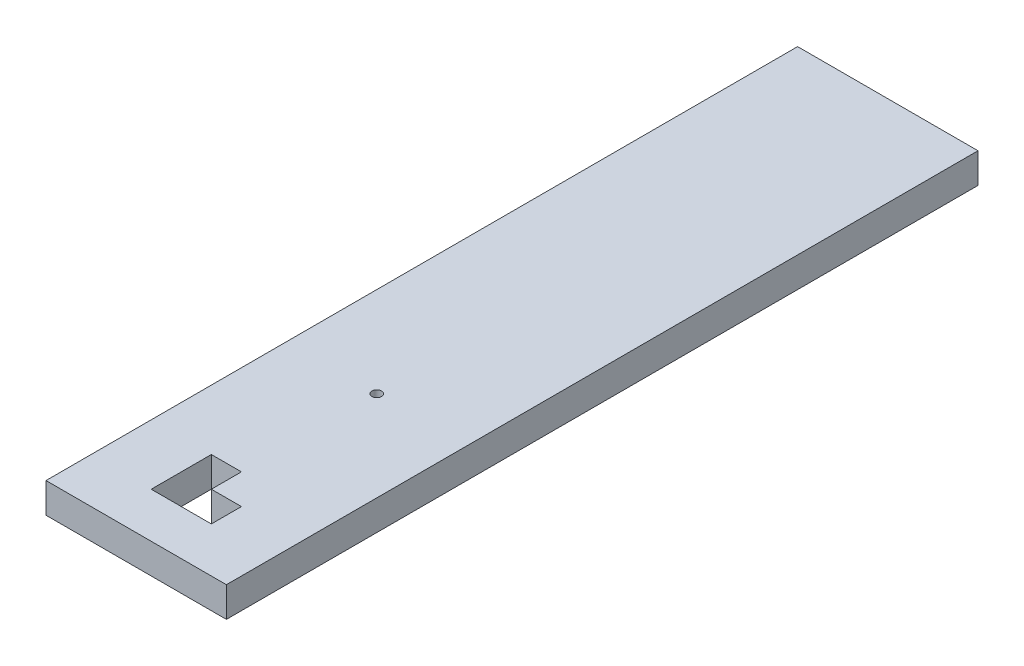
ISO-10303-21;
HEADER;
FILE_DESCRIPTION(('STEP AP214'),'2;1');
FILE_NAME('part.step','',(''),(''),'','','');
FILE_SCHEMA(('AUTOMOTIVE_DESIGN { 1 0 10303 214 1 1 1 1 }'));
ENDSEC;
DATA;
#1=APPLICATION_CONTEXT('core data for automotive mechanical design processes');
#2=APPLICATION_PROTOCOL_DEFINITION('international standard','automotive_design',2000,#1);
#3=PRODUCT_CONTEXT('',#1,'mechanical');
#4=PRODUCT('Part','Part','',(#3));
#5=PRODUCT_RELATED_PRODUCT_CATEGORY('part','',(#4));
#6=PRODUCT_DEFINITION_FORMATION('','',#4);
#7=PRODUCT_DEFINITION_CONTEXT('part definition',#1,'design');
#8=PRODUCT_DEFINITION('design','',#6,#7);
#9=PRODUCT_DEFINITION_SHAPE('','',#8);
#10=(LENGTH_UNIT() NAMED_UNIT(*) SI_UNIT(.MILLI.,.METRE.));
#11=(NAMED_UNIT(*) PLANE_ANGLE_UNIT() SI_UNIT($,.RADIAN.));
#12=(NAMED_UNIT(*) SI_UNIT($,.STERADIAN.) SOLID_ANGLE_UNIT());
#13=UNCERTAINTY_MEASURE_WITH_UNIT(LENGTH_MEASURE(1.E-05),#10,'distance_accuracy_value','');
#14=(GEOMETRIC_REPRESENTATION_CONTEXT(3) GLOBAL_UNCERTAINTY_ASSIGNED_CONTEXT((#13)) GLOBAL_UNIT_ASSIGNED_CONTEXT((#10,
#11,#12)) REPRESENTATION_CONTEXT('',''));
#15=CARTESIAN_POINT('',(0.,0.,0.));
#16=DIRECTION('',(0.,0.,1.));
#17=DIRECTION('',(1.,0.,0.));
#18=AXIS2_PLACEMENT_3D('',#15,#16,#17);
#19=CARTESIAN_POINT('',(0.,10.,0.));
#20=DIRECTION('',(0.,1.,0.));
#21=DIRECTION('',(0.,0.,1.));
#22=AXIS2_PLACEMENT_3D('',#19,#20,#21);
#23=PLANE('',#22);
#24=DIRECTION('',(0.,0.,1.));
#25=VECTOR('',#24,1.);
#26=CARTESIAN_POINT('',(0.,10.,0.));
#27=LINE('',#26,#25);
#28=CARTESIAN_POINT('',(0.,10.,0.));
#29=VERTEX_POINT('',#28);
#30=CARTESIAN_POINT('',(0.,10.,250.));
#31=VERTEX_POINT('',#30);
#32=EDGE_CURVE('E194',#29,#31,#27,.T.);
#33=ORIENTED_EDGE('',*,*,#32,.T.);
#34=DIRECTION('',(1.,0.,0.));
#35=VECTOR('',#34,1.);
#36=CARTESIAN_POINT('',(0.,10.,250.));
#37=LINE('',#36,#35);
#38=CARTESIAN_POINT('',(60.,10.,250.));
#39=VERTEX_POINT('',#38);
#40=EDGE_CURVE('E198',#31,#39,#37,.T.);
#41=ORIENTED_EDGE('',*,*,#40,.T.);
#42=DIRECTION('',(0.,0.,-1.));
#43=VECTOR('',#42,1.);
#44=CARTESIAN_POINT('',(60.,10.,0.));
#45=LINE('',#44,#43);
#46=CARTESIAN_POINT('',(60.,10.,0.));
#47=VERTEX_POINT('',#46);
#48=EDGE_CURVE('E202',#39,#47,#45,.T.);
#49=ORIENTED_EDGE('',*,*,#48,.T.);
#50=DIRECTION('',(-1.,0.,0.));
#51=VECTOR('',#50,1.);
#52=CARTESIAN_POINT('',(0.,10.,0.));
#53=LINE('',#52,#51);
#54=EDGE_CURVE('E205',#47,#29,#53,.T.);
#55=ORIENTED_EDGE('',*,*,#54,.T.);
#56=EDGE_LOOP('',(#33,#41,#49,#55));
#57=FACE_BOUND('',#56,.T.);
#58=CARTESIAN_POINT('',(30.,10.,170.));
#59=DIRECTION('',(0.,1.,0.));
#60=DIRECTION('',(0.,0.,1.));
#61=AXIS2_PLACEMENT_3D('',#58,#59,#60);
#62=CIRCLE('',#61,1.59999999999999);
#63=CARTESIAN_POINT('',(30.,10.,171.6));
#64=VERTEX_POINT('',#63);
#65=EDGE_CURVE('E186',#64,#64,#62,.T.);
#66=ORIENTED_EDGE('',*,*,#65,.F.);
#67=EDGE_LOOP('',(#66));
#68=FACE_BOUND('',#67,.T.);
#69=DIRECTION('',(0.,0.,1.));
#70=VECTOR('',#69,1.);
#71=CARTESIAN_POINT('',(20.,10.,215.));
#72=LINE('',#71,#70);
#73=CARTESIAN_POINT('',(20.,10.,215.));
#74=VERTEX_POINT('',#73);
#75=CARTESIAN_POINT('',(20.,10.,235.));
#76=VERTEX_POINT('',#75);
#77=EDGE_CURVE('E126',#74,#76,#72,.T.);
#78=ORIENTED_EDGE('',*,*,#77,.F.);
#79=DIRECTION('',(-1.,0.,0.));
#80=VECTOR('',#79,1.);
#81=CARTESIAN_POINT('',(20.,10.,215.));
#82=LINE('',#81,#80);
#83=CARTESIAN_POINT('',(30.,10.,215.));
#84=VERTEX_POINT('',#83);
#85=EDGE_CURVE('E117',#84,#74,#82,.T.);
#86=ORIENTED_EDGE('',*,*,#85,.F.);
#87=DIRECTION('',(0.,0.,-1.));
#88=VECTOR('',#87,1.);
#89=CARTESIAN_POINT('',(30.,10.,215.));
#90=LINE('',#89,#88);
#91=CARTESIAN_POINT('',(30.,10.,225.));
#92=VERTEX_POINT('',#91);
#93=EDGE_CURVE('E152',#92,#84,#90,.T.);
#94=ORIENTED_EDGE('',*,*,#93,.F.);
#95=DIRECTION('',(-1.,0.,0.));
#96=VECTOR('',#95,1.);
#97=CARTESIAN_POINT('',(30.,10.,225.));
#98=LINE('',#97,#96);
#99=CARTESIAN_POINT('',(40.,10.,225.));
#100=VERTEX_POINT('',#99);
#101=EDGE_CURVE('E149',#100,#92,#98,.T.);
#102=ORIENTED_EDGE('',*,*,#101,.F.);
#103=DIRECTION('',(0.,0.,-1.));
#104=VECTOR('',#103,1.);
#105=CARTESIAN_POINT('',(40.,10.,225.));
#106=LINE('',#105,#104);
#107=CARTESIAN_POINT('',(40.,10.,235.));
#108=VERTEX_POINT('',#107);
#109=EDGE_CURVE('E144',#108,#100,#106,.T.);
#110=ORIENTED_EDGE('',*,*,#109,.F.);
#111=DIRECTION('',(1.,0.,0.));
#112=VECTOR('',#111,1.);
#113=CARTESIAN_POINT('',(20.,10.,235.));
#114=LINE('',#113,#112);
#115=EDGE_CURVE('E140',#76,#108,#114,.T.);
#116=ORIENTED_EDGE('',*,*,#115,.F.);
#117=EDGE_LOOP('',(#78,#86,#94,#102,#110,#116));
#118=FACE_BOUND('',#117,.T.);
#119=ADVANCED_FACE('F39',(#57,#68,#118),#23,.T.);
#120=CARTESIAN_POINT('',(0.,0.,0.));
#121=DIRECTION('',(0.,1.,0.));
#122=DIRECTION('',(0.,0.,1.));
#123=AXIS2_PLACEMENT_3D('',#120,#121,#122);
#124=PLANE('',#123);
#125=CARTESIAN_POINT('',(30.,0.,170.));
#126=DIRECTION('',(0.,1.,0.));
#127=DIRECTION('',(0.,0.,1.));
#128=AXIS2_PLACEMENT_3D('',#125,#126,#127);
#129=CIRCLE('',#128,1.59999999999999);
#130=CARTESIAN_POINT('',(30.,0.,171.6));
#131=VERTEX_POINT('',#130);
#132=EDGE_CURVE('E135',#131,#131,#129,.T.);
#133=ORIENTED_EDGE('',*,*,#132,.T.);
#134=EDGE_LOOP('',(#133));
#135=FACE_BOUND('',#134,.T.);
#136=DIRECTION('',(0.,0.,1.));
#137=VECTOR('',#136,1.);
#138=CARTESIAN_POINT('',(0.,0.,0.));
#139=LINE('',#138,#137);
#140=CARTESIAN_POINT('',(0.,0.,0.));
#141=VERTEX_POINT('',#140);
#142=CARTESIAN_POINT('',(0.,0.,250.));
#143=VERTEX_POINT('',#142);
#144=EDGE_CURVE('E190',#141,#143,#139,.T.);
#145=ORIENTED_EDGE('',*,*,#144,.F.);
#146=DIRECTION('',(-1.,0.,0.));
#147=VECTOR('',#146,1.);
#148=CARTESIAN_POINT('',(0.,0.,0.));
#149=LINE('',#148,#147);
#150=CARTESIAN_POINT('',(60.,0.,0.));
#151=VERTEX_POINT('',#150);
#152=EDGE_CURVE('E199',#151,#141,#149,.T.);
#153=ORIENTED_EDGE('',*,*,#152,.F.);
#154=DIRECTION('',(0.,0.,-1.));
#155=VECTOR('',#154,1.);
#156=CARTESIAN_POINT('',(60.,0.,0.));
#157=LINE('',#156,#155);
#158=CARTESIAN_POINT('',(60.,0.,250.));
#159=VERTEX_POINT('',#158);
#160=EDGE_CURVE('E215',#159,#151,#157,.T.);
#161=ORIENTED_EDGE('',*,*,#160,.F.);
#162=DIRECTION('',(1.,0.,0.));
#163=VECTOR('',#162,1.);
#164=CARTESIAN_POINT('',(0.,0.,250.));
#165=LINE('',#164,#163);
#166=EDGE_CURVE('E212',#143,#159,#165,.T.);
#167=ORIENTED_EDGE('',*,*,#166,.F.);
#168=EDGE_LOOP('',(#145,#153,#161,#167));
#169=FACE_BOUND('',#168,.T.);
#170=DIRECTION('',(-1.,0.,0.));
#171=VECTOR('',#170,1.);
#172=CARTESIAN_POINT('',(20.,0.,215.));
#173=LINE('',#172,#171);
#174=CARTESIAN_POINT('',(30.,0.,215.));
#175=VERTEX_POINT('',#174);
#176=CARTESIAN_POINT('',(20.,0.,215.));
#177=VERTEX_POINT('',#176);
#178=EDGE_CURVE('E63',#175,#177,#173,.T.);
#179=ORIENTED_EDGE('',*,*,#178,.T.);
#180=DIRECTION('',(0.,0.,1.));
#181=VECTOR('',#180,1.);
#182=CARTESIAN_POINT('',(20.,0.,215.));
#183=LINE('',#182,#181);
#184=CARTESIAN_POINT('',(20.,0.,235.));
#185=VERTEX_POINT('',#184);
#186=EDGE_CURVE('E133',#177,#185,#183,.T.);
#187=ORIENTED_EDGE('',*,*,#186,.T.);
#188=DIRECTION('',(1.,0.,0.));
#189=VECTOR('',#188,1.);
#190=CARTESIAN_POINT('',(20.,0.,235.));
#191=LINE('',#190,#189);
#192=CARTESIAN_POINT('',(40.,0.,235.));
#193=VERTEX_POINT('',#192);
#194=EDGE_CURVE('E159',#185,#193,#191,.T.);
#195=ORIENTED_EDGE('',*,*,#194,.T.);
#196=DIRECTION('',(0.,0.,-1.));
#197=VECTOR('',#196,1.);
#198=CARTESIAN_POINT('',(40.,0.,225.));
#199=LINE('',#198,#197);
#200=CARTESIAN_POINT('',(40.,0.,225.));
#201=VERTEX_POINT('',#200);
#202=EDGE_CURVE('E163',#193,#201,#199,.T.);
#203=ORIENTED_EDGE('',*,*,#202,.T.);
#204=DIRECTION('',(-1.,0.,0.));
#205=VECTOR('',#204,1.);
#206=CARTESIAN_POINT('',(30.,0.,225.));
#207=LINE('',#206,#205);
#208=CARTESIAN_POINT('',(30.,0.,225.));
#209=VERTEX_POINT('',#208);
#210=EDGE_CURVE('E167',#201,#209,#207,.T.);
#211=ORIENTED_EDGE('',*,*,#210,.T.);
#212=DIRECTION('',(0.,0.,-1.));
#213=VECTOR('',#212,1.);
#214=CARTESIAN_POINT('',(30.,0.,215.));
#215=LINE('',#214,#213);
#216=EDGE_CURVE('E127',#209,#175,#215,.T.);
#217=ORIENTED_EDGE('',*,*,#216,.T.);
#218=EDGE_LOOP('',(#179,#187,#195,#203,#211,#217));
#219=FACE_BOUND('',#218,.T.);
#220=ADVANCED_FACE('F238',(#135,#169,#219),#124,.F.);
#221=CARTESIAN_POINT('',(0.,10.,0.));
#222=DIRECTION('',(1.,0.,0.));
#223=DIRECTION('',(0.,0.,-1.));
#224=AXIS2_PLACEMENT_3D('',#221,#222,#223);
#225=PLANE('',#224);
#226=ORIENTED_EDGE('',*,*,#144,.T.);
#227=DIRECTION('',(0.,-1.,0.));
#228=VECTOR('',#227,1.);
#229=CARTESIAN_POINT('',(0.,10.,250.));
#230=LINE('',#229,#228);
#231=EDGE_CURVE('E11',#31,#143,#230,.T.);
#232=ORIENTED_EDGE('',*,*,#231,.F.);
#233=ORIENTED_EDGE('',*,*,#32,.F.);
#234=DIRECTION('',(0.,-1.,0.));
#235=VECTOR('',#234,1.);
#236=CARTESIAN_POINT('',(0.,10.,0.));
#237=LINE('',#236,#235);
#238=EDGE_CURVE('E208',#29,#141,#237,.T.);
#239=ORIENTED_EDGE('',*,*,#238,.T.);
#240=EDGE_LOOP('',(#226,#232,#233,#239));
#241=FACE_BOUND('',#240,.T.);
#242=ADVANCED_FACE('F41',(#241),#225,.F.);
#243=CARTESIAN_POINT('',(0.,10.,250.));
#244=DIRECTION('',(0.,0.,-1.));
#245=DIRECTION('',(-1.,0.,0.));
#246=AXIS2_PLACEMENT_3D('',#243,#244,#245);
#247=PLANE('',#246);
#248=ORIENTED_EDGE('',*,*,#166,.T.);
#249=DIRECTION('',(0.,-1.,0.));
#250=VECTOR('',#249,1.);
#251=CARTESIAN_POINT('',(60.,10.,250.));
#252=LINE('',#251,#250);
#253=EDGE_CURVE('E48',#39,#159,#252,.T.);
#254=ORIENTED_EDGE('',*,*,#253,.F.);
#255=ORIENTED_EDGE('',*,*,#40,.F.);
#256=ORIENTED_EDGE('',*,*,#231,.T.);
#257=EDGE_LOOP('',(#248,#254,#255,#256));
#258=FACE_BOUND('',#257,.T.);
#259=ADVANCED_FACE('F249',(#258),#247,.F.);
#260=CARTESIAN_POINT('',(60.,10.,0.));
#261=DIRECTION('',(-1.,0.,0.));
#262=DIRECTION('',(0.,0.,1.));
#263=AXIS2_PLACEMENT_3D('',#260,#261,#262);
#264=PLANE('',#263);
#265=ORIENTED_EDGE('',*,*,#160,.T.);
#266=DIRECTION('',(0.,-1.,0.));
#267=VECTOR('',#266,1.);
#268=CARTESIAN_POINT('',(60.,10.,0.));
#269=LINE('',#268,#267);
#270=EDGE_CURVE('E223',#47,#151,#269,.T.);
#271=ORIENTED_EDGE('',*,*,#270,.F.);
#272=ORIENTED_EDGE('',*,*,#48,.F.);
#273=ORIENTED_EDGE('',*,*,#253,.T.);
#274=EDGE_LOOP('',(#265,#271,#272,#273));
#275=FACE_BOUND('',#274,.T.);
#276=ADVANCED_FACE('F232',(#275),#264,.F.);
#277=CARTESIAN_POINT('',(0.,10.,0.));
#278=DIRECTION('',(0.,0.,1.));
#279=DIRECTION('',(1.,0.,0.));
#280=AXIS2_PLACEMENT_3D('',#277,#278,#279);
#281=PLANE('',#280);
#282=ORIENTED_EDGE('',*,*,#152,.T.);
#283=ORIENTED_EDGE('',*,*,#238,.F.);
#284=ORIENTED_EDGE('',*,*,#54,.F.);
#285=ORIENTED_EDGE('',*,*,#270,.T.);
#286=EDGE_LOOP('',(#282,#283,#284,#285));
#287=FACE_BOUND('',#286,.T.);
#288=ADVANCED_FACE('F242',(#287),#281,.F.);
#289=CARTESIAN_POINT('',(30.,10.,170.));
#290=DIRECTION('',(0.,-1.,0.));
#291=DIRECTION('',(0.,0.,-1.));
#292=AXIS2_PLACEMENT_3D('',#289,#290,#291);
#293=CYLINDRICAL_SURFACE('',#292,1.59999999999999);
#294=ORIENTED_EDGE('',*,*,#65,.T.);
#295=EDGE_LOOP('',(#294));
#296=FACE_BOUND('',#295,.T.);
#297=ORIENTED_EDGE('',*,*,#132,.F.);
#298=EDGE_LOOP('',(#297));
#299=FACE_BOUND('',#298,.T.);
#300=ADVANCED_FACE('F264',(#296,#299),#293,.F.);
#301=CARTESIAN_POINT('',(20.,10.,215.));
#302=DIRECTION('',(0.,0.,1.));
#303=DIRECTION('',(1.,0.,0.));
#304=AXIS2_PLACEMENT_3D('',#301,#302,#303);
#305=PLANE('',#304);
#306=ORIENTED_EDGE('',*,*,#178,.F.);
#307=DIRECTION('',(0.,-1.,0.));
#308=VECTOR('',#307,1.);
#309=CARTESIAN_POINT('',(30.,10.,215.));
#310=LINE('',#309,#308);
#311=EDGE_CURVE('E121',#84,#175,#310,.T.);
#312=ORIENTED_EDGE('',*,*,#311,.F.);
#313=ORIENTED_EDGE('',*,*,#85,.T.);
#314=DIRECTION('',(0.,-1.,0.));
#315=VECTOR('',#314,1.);
#316=CARTESIAN_POINT('',(20.,10.,215.));
#317=LINE('',#316,#315);
#318=EDGE_CURVE('E120',#74,#177,#317,.T.);
#319=ORIENTED_EDGE('',*,*,#318,.T.);
#320=EDGE_LOOP('',(#306,#312,#313,#319));
#321=FACE_BOUND('',#320,.T.);
#322=ADVANCED_FACE('F119',(#321),#305,.T.);
#323=CARTESIAN_POINT('',(20.,10.,215.));
#324=DIRECTION('',(1.,0.,0.));
#325=DIRECTION('',(0.,0.,-1.));
#326=AXIS2_PLACEMENT_3D('',#323,#324,#325);
#327=PLANE('',#326);
#328=ORIENTED_EDGE('',*,*,#186,.F.);
#329=ORIENTED_EDGE('',*,*,#318,.F.);
#330=ORIENTED_EDGE('',*,*,#77,.T.);
#331=DIRECTION('',(0.,-1.,0.));
#332=VECTOR('',#331,1.);
#333=CARTESIAN_POINT('',(20.,10.,235.));
#334=LINE('',#333,#332);
#335=EDGE_CURVE('E136',#76,#185,#334,.T.);
#336=ORIENTED_EDGE('',*,*,#335,.T.);
#337=EDGE_LOOP('',(#328,#329,#330,#336));
#338=FACE_BOUND('',#337,.T.);
#339=ADVANCED_FACE('F130',(#338),#327,.T.);
#340=CARTESIAN_POINT('',(20.,10.,235.));
#341=DIRECTION('',(0.,0.,-1.));
#342=DIRECTION('',(-1.,0.,0.));
#343=AXIS2_PLACEMENT_3D('',#340,#341,#342);
#344=PLANE('',#343);
#345=ORIENTED_EDGE('',*,*,#194,.F.);
#346=ORIENTED_EDGE('',*,*,#335,.F.);
#347=ORIENTED_EDGE('',*,*,#115,.T.);
#348=DIRECTION('',(0.,-1.,0.));
#349=VECTOR('',#348,1.);
#350=CARTESIAN_POINT('',(40.,10.,235.));
#351=LINE('',#350,#349);
#352=EDGE_CURVE('E181',#108,#193,#351,.T.);
#353=ORIENTED_EDGE('',*,*,#352,.T.);
#354=EDGE_LOOP('',(#345,#346,#347,#353));
#355=FACE_BOUND('',#354,.T.);
#356=ADVANCED_FACE('F281',(#355),#344,.T.);
#357=CARTESIAN_POINT('',(40.,10.,225.));
#358=DIRECTION('',(-1.,0.,0.));
#359=DIRECTION('',(0.,0.,1.));
#360=AXIS2_PLACEMENT_3D('',#357,#358,#359);
#361=PLANE('',#360);
#362=ORIENTED_EDGE('',*,*,#202,.F.);
#363=ORIENTED_EDGE('',*,*,#352,.F.);
#364=ORIENTED_EDGE('',*,*,#109,.T.);
#365=DIRECTION('',(0.,-1.,0.));
#366=VECTOR('',#365,1.);
#367=CARTESIAN_POINT('',(40.,10.,225.));
#368=LINE('',#367,#366);
#369=EDGE_CURVE('E178',#100,#201,#368,.T.);
#370=ORIENTED_EDGE('',*,*,#369,.T.);
#371=EDGE_LOOP('',(#362,#363,#364,#370));
#372=FACE_BOUND('',#371,.T.);
#373=ADVANCED_FACE('F286',(#372),#361,.T.);
#374=CARTESIAN_POINT('',(30.,10.,225.));
#375=DIRECTION('',(0.,0.,1.));
#376=DIRECTION('',(1.,0.,0.));
#377=AXIS2_PLACEMENT_3D('',#374,#375,#376);
#378=PLANE('',#377);
#379=ORIENTED_EDGE('',*,*,#210,.F.);
#380=ORIENTED_EDGE('',*,*,#369,.F.);
#381=ORIENTED_EDGE('',*,*,#101,.T.);
#382=DIRECTION('',(0.,-1.,0.));
#383=VECTOR('',#382,1.);
#384=CARTESIAN_POINT('',(30.,10.,225.));
#385=LINE('',#384,#383);
#386=EDGE_CURVE('E55',#92,#209,#385,.T.);
#387=ORIENTED_EDGE('',*,*,#386,.T.);
#388=EDGE_LOOP('',(#379,#380,#381,#387));
#389=FACE_BOUND('',#388,.T.);
#390=ADVANCED_FACE('F290',(#389),#378,.T.);
#391=CARTESIAN_POINT('',(30.,10.,215.));
#392=DIRECTION('',(-1.,0.,0.));
#393=DIRECTION('',(0.,0.,1.));
#394=AXIS2_PLACEMENT_3D('',#391,#392,#393);
#395=PLANE('',#394);
#396=ORIENTED_EDGE('',*,*,#216,.F.);
#397=ORIENTED_EDGE('',*,*,#386,.F.);
#398=ORIENTED_EDGE('',*,*,#93,.T.);
#399=ORIENTED_EDGE('',*,*,#311,.T.);
#400=EDGE_LOOP('',(#396,#397,#398,#399));
#401=FACE_BOUND('',#400,.T.);
#402=ADVANCED_FACE('F294',(#401),#395,.T.);
#403=CLOSED_SHELL('',(#119,#220,#242,#259,#276,#288,#300,#322,#339,#356,#373,#390,#402));
#404=MANIFOLD_SOLID_BREP('B2',#403);
#405=ADVANCED_BREP_SHAPE_REPRESENTATION('',(#18,#404),#14);
#406=SHAPE_DEFINITION_REPRESENTATION(#9,#405);
ENDSEC;
END-ISO-10303-21;
